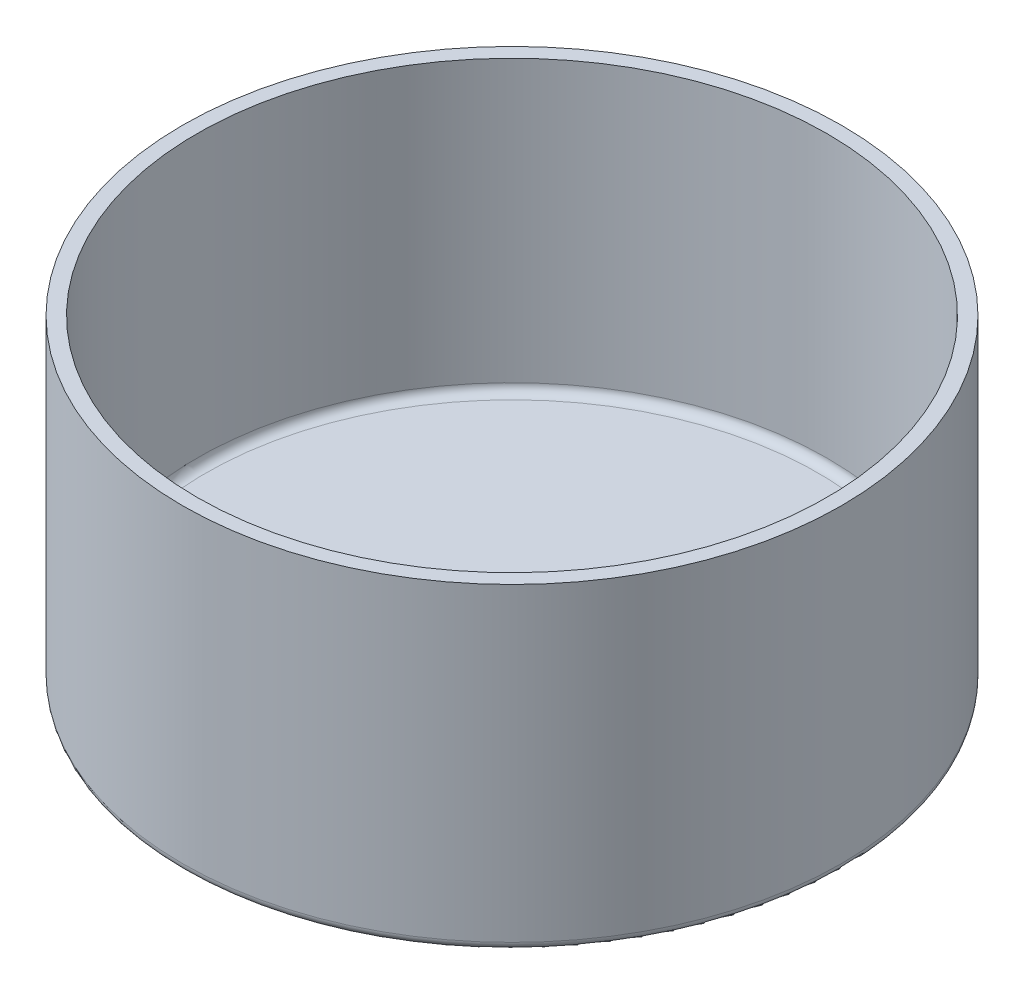
ISO-10303-21;
HEADER;
FILE_DESCRIPTION(('STEP AP214'),'2;1');
FILE_NAME('part.step','',(''),(''),'','','');
FILE_SCHEMA(('AUTOMOTIVE_DESIGN { 1 0 10303 214 1 1 1 1 }'));
ENDSEC;
DATA;
#1=APPLICATION_CONTEXT('core data for automotive mechanical design processes');
#2=APPLICATION_PROTOCOL_DEFINITION('international standard','automotive_design',2000,#1);
#3=PRODUCT_CONTEXT('',#1,'mechanical');
#4=PRODUCT('Part','Part','',(#3));
#5=PRODUCT_RELATED_PRODUCT_CATEGORY('part','',(#4));
#6=PRODUCT_DEFINITION_FORMATION('','',#4);
#7=PRODUCT_DEFINITION_CONTEXT('part definition',#1,'design');
#8=PRODUCT_DEFINITION('design','',#6,#7);
#9=PRODUCT_DEFINITION_SHAPE('','',#8);
#10=(LENGTH_UNIT() NAMED_UNIT(*) SI_UNIT(.MILLI.,.METRE.));
#11=(NAMED_UNIT(*) PLANE_ANGLE_UNIT() SI_UNIT($,.RADIAN.));
#12=(NAMED_UNIT(*) SI_UNIT($,.STERADIAN.) SOLID_ANGLE_UNIT());
#13=UNCERTAINTY_MEASURE_WITH_UNIT(LENGTH_MEASURE(1.E-05),#10,'distance_accuracy_value','');
#14=(GEOMETRIC_REPRESENTATION_CONTEXT(3) GLOBAL_UNCERTAINTY_ASSIGNED_CONTEXT((#13)) GLOBAL_UNIT_ASSIGNED_CONTEXT((#10,
#11,#12)) REPRESENTATION_CONTEXT('',''));
#15=CARTESIAN_POINT('',(0.,0.,0.));
#16=DIRECTION('',(0.,0.,1.));
#17=DIRECTION('',(1.,0.,0.));
#18=AXIS2_PLACEMENT_3D('',#15,#16,#17);
#19=CARTESIAN_POINT('',(0.,1.,0.));
#20=DIRECTION('',(0.,-1.,0.));
#21=DIRECTION('',(0.,0.,-1.));
#22=AXIS2_PLACEMENT_3D('',#19,#20,#21);
#23=CYLINDRICAL_SURFACE('',#22,11.375);
#24=CARTESIAN_POINT('',(0.,0.3,0.));
#25=DIRECTION('',(0.,1.,0.));
#26=DIRECTION('',(0.,0.,1.));
#27=AXIS2_PLACEMENT_3D('',#24,#25,#26);
#28=CIRCLE('',#27,11.375);
#29=CARTESIAN_POINT('',(0.,0.3,11.375));
#30=VERTEX_POINT('',#29);
#31=EDGE_CURVE('E44',#30,#30,#28,.T.);
#32=ORIENTED_EDGE('',*,*,#31,.T.);
#33=EDGE_LOOP('',(#32));
#34=FACE_BOUND('',#33,.T.);
#35=CARTESIAN_POINT('',(0.,11.,0.));
#36=DIRECTION('',(0.,1.,0.));
#37=DIRECTION('',(0.,0.,1.));
#38=AXIS2_PLACEMENT_3D('',#35,#36,#37);
#39=CIRCLE('',#38,11.375);
#40=CARTESIAN_POINT('',(0.,11.,11.375));
#41=VERTEX_POINT('',#40);
#42=EDGE_CURVE('E60',#41,#41,#39,.T.);
#43=ORIENTED_EDGE('',*,*,#42,.F.);
#44=EDGE_LOOP('',(#43));
#45=FACE_BOUND('',#44,.T.);
#46=ADVANCED_FACE('F36',(#34,#45),#23,.T.);
#47=CARTESIAN_POINT('',(0.,0.,0.));
#48=DIRECTION('',(0.,1.,0.));
#49=DIRECTION('',(0.,0.,1.));
#50=AXIS2_PLACEMENT_3D('',#47,#48,#49);
#51=PLANE('',#50);
#52=CARTESIAN_POINT('',(0.,0.,0.));
#53=DIRECTION('',(0.,1.,0.));
#54=DIRECTION('',(0.,0.,1.));
#55=AXIS2_PLACEMENT_3D('',#52,#53,#54);
#56=CIRCLE('',#55,11.075);
#57=CARTESIAN_POINT('',(0.,0.,11.075));
#58=VERTEX_POINT('',#57);
#59=EDGE_CURVE('E10',#58,#58,#56,.F.);
#60=ORIENTED_EDGE('',*,*,#59,.T.);
#61=EDGE_LOOP('',(#60));
#62=FACE_BOUND('',#61,.T.);
#63=ADVANCED_FACE('F73',(#62),#51,.F.);
#64=CARTESIAN_POINT('',(0.,11.,0.));
#65=DIRECTION('',(0.,1.,0.));
#66=DIRECTION('',(0.,0.,1.));
#67=AXIS2_PLACEMENT_3D('',#64,#65,#66);
#68=PLANE('',#67);
#69=ORIENTED_EDGE('',*,*,#42,.T.);
#70=EDGE_LOOP('',(#69));
#71=FACE_BOUND('',#70,.T.);
#72=CARTESIAN_POINT('',(0.,11.,0.));
#73=DIRECTION('',(0.,1.,0.));
#74=DIRECTION('',(0.,0.,1.));
#75=AXIS2_PLACEMENT_3D('',#72,#73,#74);
#76=CIRCLE('',#75,10.875);
#77=CARTESIAN_POINT('',(0.,11.,10.875));
#78=VERTEX_POINT('',#77);
#79=EDGE_CURVE('E64',#78,#78,#76,.T.);
#80=ORIENTED_EDGE('',*,*,#79,.F.);
#81=EDGE_LOOP('',(#80));
#82=FACE_BOUND('',#81,.T.);
#83=ADVANCED_FACE('F71',(#71,#82),#68,.T.);
#84=CARTESIAN_POINT('',(0.,11.,0.));
#85=DIRECTION('',(0.,-1.,0.));
#86=DIRECTION('',(0.,0.,-1.));
#87=AXIS2_PLACEMENT_3D('',#84,#85,#86);
#88=CYLINDRICAL_SURFACE('',#87,10.875);
#89=CARTESIAN_POINT('',(0.,1.3,0.));
#90=DIRECTION('',(0.,1.,0.));
#91=DIRECTION('',(0.,0.,1.));
#92=AXIS2_PLACEMENT_3D('',#89,#90,#91);
#93=CIRCLE('',#92,10.875);
#94=CARTESIAN_POINT('',(0.,1.3,10.875));
#95=VERTEX_POINT('',#94);
#96=EDGE_CURVE('E54',#95,#95,#93,.F.);
#97=ORIENTED_EDGE('',*,*,#96,.T.);
#98=EDGE_LOOP('',(#97));
#99=FACE_BOUND('',#98,.T.);
#100=ORIENTED_EDGE('',*,*,#79,.T.);
#101=EDGE_LOOP('',(#100));
#102=FACE_BOUND('',#101,.T.);
#103=ADVANCED_FACE('F69',(#99,#102),#88,.F.);
#104=CARTESIAN_POINT('',(0.,1.,0.));
#105=DIRECTION('',(0.,1.,0.));
#106=DIRECTION('',(0.,0.,1.));
#107=AXIS2_PLACEMENT_3D('',#104,#105,#106);
#108=PLANE('',#107);
#109=CARTESIAN_POINT('',(0.,1.,0.));
#110=DIRECTION('',(0.,1.,0.));
#111=DIRECTION('',(0.,0.,1.));
#112=AXIS2_PLACEMENT_3D('',#109,#110,#111);
#113=CIRCLE('',#112,10.575);
#114=CARTESIAN_POINT('',(0.,1.,10.575));
#115=VERTEX_POINT('',#114);
#116=EDGE_CURVE('E49',#115,#115,#113,.T.);
#117=ORIENTED_EDGE('',*,*,#116,.T.);
#118=EDGE_LOOP('',(#117));
#119=FACE_BOUND('',#118,.T.);
#120=ADVANCED_FACE('F80',(#119),#108,.T.);
#121=CARTESIAN_POINT('',(0.,1.3,0.));
#122=DIRECTION('',(0.,1.,0.));
#123=DIRECTION('',(0.,0.,1.));
#124=AXIS2_PLACEMENT_3D('',#121,#122,#123);
#125=TOROIDAL_SURFACE('',#124,10.575,0.3);
#126=ORIENTED_EDGE('',*,*,#116,.F.);
#127=EDGE_LOOP('',(#126));
#128=FACE_BOUND('',#127,.T.);
#129=ORIENTED_EDGE('',*,*,#96,.F.);
#130=EDGE_LOOP('',(#129));
#131=FACE_BOUND('',#130,.T.);
#132=ADVANCED_FACE('F92',(#128,#131),#125,.F.);
#133=CARTESIAN_POINT('',(0.,0.3,0.));
#134=DIRECTION('',(0.,1.,0.));
#135=DIRECTION('',(0.,0.,1.));
#136=AXIS2_PLACEMENT_3D('',#133,#134,#135);
#137=TOROIDAL_SURFACE('',#136,11.075,0.3);
#138=ORIENTED_EDGE('',*,*,#59,.F.);
#139=EDGE_LOOP('',(#138));
#140=FACE_BOUND('',#139,.T.);
#141=ORIENTED_EDGE('',*,*,#31,.F.);
#142=EDGE_LOOP('',(#141));
#143=FACE_BOUND('',#142,.T.);
#144=ADVANCED_FACE('F38',(#140,#143),#137,.T.);
#145=CLOSED_SHELL('',(#46,#63,#83,#103,#120,#132,#144));
#146=MANIFOLD_SOLID_BREP('B2',#145);
#147=ADVANCED_BREP_SHAPE_REPRESENTATION('',(#18,#146),#14);
#148=SHAPE_DEFINITION_REPRESENTATION(#9,#147);
ENDSEC;
END-ISO-10303-21;
